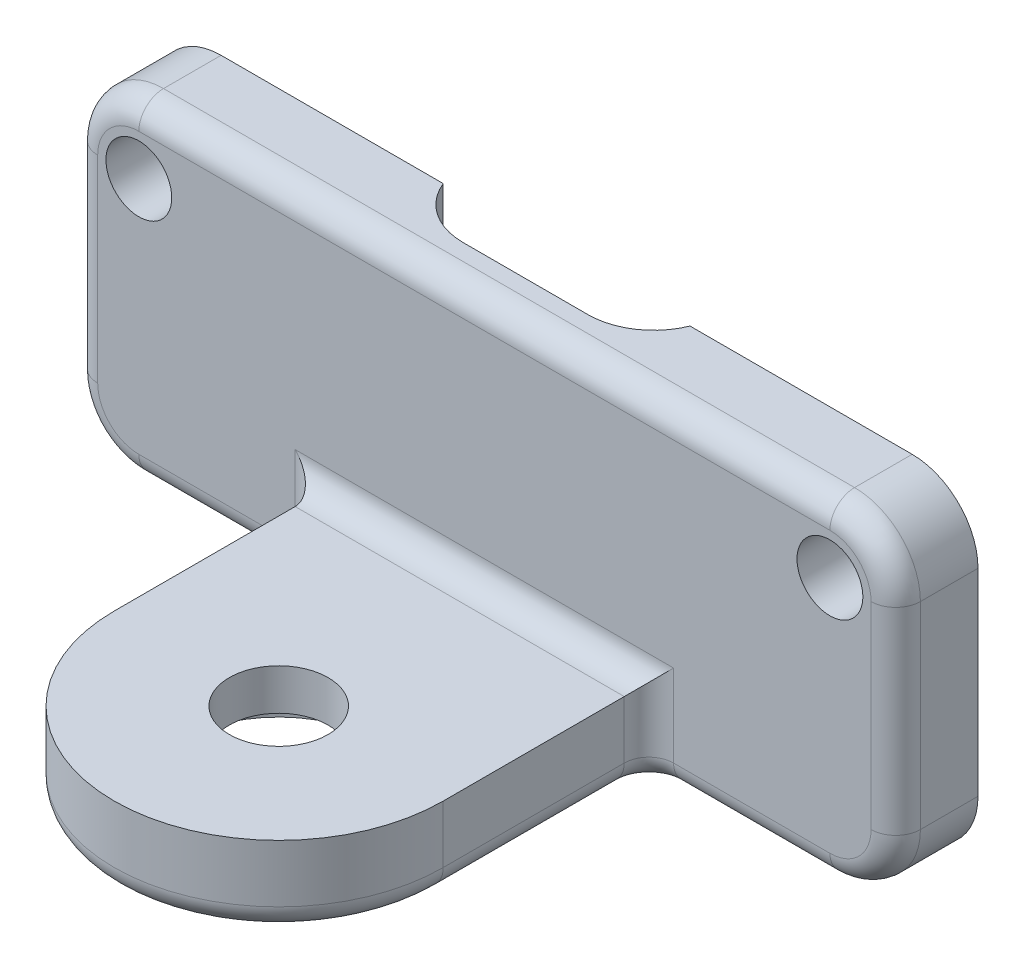
ISO-10303-21;
HEADER;
FILE_DESCRIPTION(('STEP AP214'),'2;1');
FILE_NAME('part.step','',(''),(''),'','','');
FILE_SCHEMA(('AUTOMOTIVE_DESIGN { 1 0 10303 214 1 1 1 1 }'));
ENDSEC;
DATA;
#1=APPLICATION_CONTEXT('core data for automotive mechanical design processes');
#2=APPLICATION_PROTOCOL_DEFINITION('international standard','automotive_design',2000,#1);
#3=PRODUCT_CONTEXT('',#1,'mechanical');
#4=PRODUCT('Part','Part','',(#3));
#5=PRODUCT_RELATED_PRODUCT_CATEGORY('part','',(#4));
#6=PRODUCT_DEFINITION_FORMATION('','',#4);
#7=PRODUCT_DEFINITION_CONTEXT('part definition',#1,'design');
#8=PRODUCT_DEFINITION('design','',#6,#7);
#9=PRODUCT_DEFINITION_SHAPE('','',#8);
#10=(LENGTH_UNIT() NAMED_UNIT(*) SI_UNIT(.MILLI.,.METRE.));
#11=(NAMED_UNIT(*) PLANE_ANGLE_UNIT() SI_UNIT($,.RADIAN.));
#12=(NAMED_UNIT(*) SI_UNIT($,.STERADIAN.) SOLID_ANGLE_UNIT());
#13=UNCERTAINTY_MEASURE_WITH_UNIT(LENGTH_MEASURE(1.E-05),#10,'distance_accuracy_value','');
#14=(GEOMETRIC_REPRESENTATION_CONTEXT(3) GLOBAL_UNCERTAINTY_ASSIGNED_CONTEXT((#13)) GLOBAL_UNIT_ASSIGNED_CONTEXT((#10,
#11,#12)) REPRESENTATION_CONTEXT('',''));
#15=CARTESIAN_POINT('',(0.,0.,0.));
#16=DIRECTION('',(0.,0.,1.));
#17=DIRECTION('',(1.,0.,0.));
#18=AXIS2_PLACEMENT_3D('',#15,#16,#17);
#19=CARTESIAN_POINT('',(0.,0.,0.));
#20=DIRECTION('',(0.,0.,1.));
#21=DIRECTION('',(1.,0.,0.));
#22=AXIS2_PLACEMENT_3D('',#19,#20,#21);
#23=PLANE('',#22);
#24=CARTESIAN_POINT('',(-42.,12.,0.));
#25=DIRECTION('',(0.,0.,1.));
#26=DIRECTION('',(1.,0.,0.));
#27=AXIS2_PLACEMENT_3D('',#24,#25,#26);
#28=CIRCLE('',#27,4.00000000000001);
#29=CARTESIAN_POINT('',(-38.,12.,0.));
#30=VERTEX_POINT('',#29);
#31=EDGE_CURVE('E305',#30,#30,#28,.T.);
#32=ORIENTED_EDGE('',*,*,#31,.T.);
#33=EDGE_LOOP('',(#32));
#34=FACE_BOUND('',#33,.T.);
#35=DIRECTION('',(1.,0.,0.));
#36=VECTOR('',#35,1.);
#37=CARTESIAN_POINT('',(50.,-20.,0.));
#38=LINE('',#37,#36);
#39=CARTESIAN_POINT('',(-42.,-20.,0.));
#40=VERTEX_POINT('',#39);
#41=CARTESIAN_POINT('',(-15.,-20.,0.));
#42=VERTEX_POINT('',#41);
#43=EDGE_CURVE('E395',#40,#42,#38,.T.);
#44=ORIENTED_EDGE('',*,*,#43,.F.);
#45=CARTESIAN_POINT('',(-42.,-12.,0.));
#46=DIRECTION('',(0.,0.,1.));
#47=DIRECTION('',(1.,0.,0.));
#48=AXIS2_PLACEMENT_3D('',#45,#46,#47);
#49=CIRCLE('',#48,8.);
#50=CARTESIAN_POINT('',(-50.,-12.,0.));
#51=VERTEX_POINT('',#50);
#52=EDGE_CURVE('E419',#40,#51,#49,.F.);
#53=ORIENTED_EDGE('',*,*,#52,.T.);
#54=DIRECTION('',(0.,-1.,0.));
#55=VECTOR('',#54,1.);
#56=CARTESIAN_POINT('',(-50.,-20.,0.));
#57=LINE('',#56,#55);
#58=CARTESIAN_POINT('',(-50.,12.,0.));
#59=VERTEX_POINT('',#58);
#60=EDGE_CURVE('E392',#59,#51,#57,.T.);
#61=ORIENTED_EDGE('',*,*,#60,.F.);
#62=CARTESIAN_POINT('',(-42.,12.,0.));
#63=DIRECTION('',(0.,0.,1.));
#64=DIRECTION('',(1.,0.,0.));
#65=AXIS2_PLACEMENT_3D('',#62,#63,#64);
#66=CIRCLE('',#65,8.);
#67=CARTESIAN_POINT('',(-42.,20.,0.));
#68=VERTEX_POINT('',#67);
#69=EDGE_CURVE('E417',#59,#68,#66,.F.);
#70=ORIENTED_EDGE('',*,*,#69,.T.);
#71=DIRECTION('',(-1.,0.,0.));
#72=VECTOR('',#71,1.);
#73=CARTESIAN_POINT('',(50.,20.,0.));
#74=LINE('',#73,#72);
#75=CARTESIAN_POINT('',(-15.,20.,0.));
#76=VERTEX_POINT('',#75);
#77=EDGE_CURVE('E215',#76,#68,#74,.T.);
#78=ORIENTED_EDGE('',*,*,#77,.F.);
#79=DIRECTION('',(0.,-1.,0.));
#80=VECTOR('',#79,1.);
#81=CARTESIAN_POINT('',(-15.,20.,0.));
#82=LINE('',#81,#80);
#83=EDGE_CURVE('E226',#76,#42,#82,.T.);
#84=ORIENTED_EDGE('',*,*,#83,.T.);
#85=EDGE_LOOP('',(#44,#53,#61,#70,#78,#84));
#86=FACE_BOUND('',#85,.T.);
#87=ADVANCED_FACE('F35',(#34,#86),#23,.F.);
#88=CARTESIAN_POINT('',(0.,0.,10.));
#89=DIRECTION('',(0.,0.,1.));
#90=DIRECTION('',(1.,0.,0.));
#91=AXIS2_PLACEMENT_3D('',#88,#89,#90);
#92=PLANE('',#91);
#93=CARTESIAN_POINT('',(-42.,12.,10.));
#94=DIRECTION('',(0.,0.,1.));
#95=DIRECTION('',(1.,0.,0.));
#96=AXIS2_PLACEMENT_3D('',#93,#94,#95);
#97=CIRCLE('',#96,4.00000000000001);
#98=CARTESIAN_POINT('',(-38.,12.,10.));
#99=VERTEX_POINT('',#98);
#100=EDGE_CURVE('E554',#99,#99,#97,.T.);
#101=ORIENTED_EDGE('',*,*,#100,.F.);
#102=EDGE_LOOP('',(#101));
#103=FACE_BOUND('',#102,.T.);
#104=CARTESIAN_POINT('',(42.,12.,10.));
#105=DIRECTION('',(0.,0.,1.));
#106=DIRECTION('',(-1.,0.,0.));
#107=AXIS2_PLACEMENT_3D('',#104,#105,#106);
#108=CIRCLE('',#107,4.00000000000001);
#109=CARTESIAN_POINT('',(38.,12.,10.));
#110=VERTEX_POINT('',#109);
#111=EDGE_CURVE('E555',#110,#110,#108,.T.);
#112=ORIENTED_EDGE('',*,*,#111,.F.);
#113=EDGE_LOOP('',(#112));
#114=FACE_BOUND('',#113,.T.);
#115=DIRECTION('',(-1.,0.,0.));
#116=VECTOR('',#115,1.);
#117=CARTESIAN_POINT('',(20.,-7.,10.));
#118=LINE('',#117,#116);
#119=CARTESIAN_POINT('',(-23.,-7.,10.));
#120=VERTEX_POINT('',#119);
#121=CARTESIAN_POINT('',(23.,-7.,10.));
#122=VERTEX_POINT('',#121);
#123=EDGE_CURVE('E285',#120,#122,#118,.F.);
#124=ORIENTED_EDGE('',*,*,#123,.T.);
#125=DIRECTION('',(0.,1.,0.));
#126=VECTOR('',#125,1.);
#127=CARTESIAN_POINT('',(23.,-20.,10.));
#128=LINE('',#127,#126);
#129=CARTESIAN_POINT('',(23.,-17.,10.));
#130=VERTEX_POINT('',#129);
#131=EDGE_CURVE('E287',#122,#130,#128,.F.);
#132=ORIENTED_EDGE('',*,*,#131,.T.);
#133=DIRECTION('',(1.,0.,0.));
#134=VECTOR('',#133,1.);
#135=CARTESIAN_POINT('',(42.,-17.,10.));
#136=LINE('',#135,#134);
#137=CARTESIAN_POINT('',(42.,-17.,10.));
#138=VERTEX_POINT('',#137);
#139=EDGE_CURVE('E265',#130,#138,#136,.T.);
#140=ORIENTED_EDGE('',*,*,#139,.T.);
#141=CARTESIAN_POINT('',(42.,-12.,10.));
#142=DIRECTION('',(0.,0.,1.));
#143=DIRECTION('',(1.,0.,0.));
#144=AXIS2_PLACEMENT_3D('',#141,#142,#143);
#145=CIRCLE('',#144,5.);
#146=CARTESIAN_POINT('',(47.,-12.,10.));
#147=VERTEX_POINT('',#146);
#148=EDGE_CURVE('E267',#138,#147,#145,.T.);
#149=ORIENTED_EDGE('',*,*,#148,.T.);
#150=DIRECTION('',(0.,1.,0.));
#151=VECTOR('',#150,1.);
#152=CARTESIAN_POINT('',(47.,12.,10.));
#153=LINE('',#152,#151);
#154=CARTESIAN_POINT('',(47.,12.,10.));
#155=VERTEX_POINT('',#154);
#156=EDGE_CURVE('E269',#147,#155,#153,.T.);
#157=ORIENTED_EDGE('',*,*,#156,.T.);
#158=CARTESIAN_POINT('',(42.,12.,10.));
#159=DIRECTION('',(0.,0.,1.));
#160=DIRECTION('',(1.,0.,0.));
#161=AXIS2_PLACEMENT_3D('',#158,#159,#160);
#162=CIRCLE('',#161,5.);
#163=CARTESIAN_POINT('',(42.,17.,10.));
#164=VERTEX_POINT('',#163);
#165=EDGE_CURVE('E271',#155,#164,#162,.T.);
#166=ORIENTED_EDGE('',*,*,#165,.T.);
#167=DIRECTION('',(-1.,0.,0.));
#168=VECTOR('',#167,1.);
#169=CARTESIAN_POINT('',(-42.,17.,10.));
#170=LINE('',#169,#168);
#171=CARTESIAN_POINT('',(-42.,17.,10.));
#172=VERTEX_POINT('',#171);
#173=EDGE_CURVE('E273',#164,#172,#170,.T.);
#174=ORIENTED_EDGE('',*,*,#173,.T.);
#175=CARTESIAN_POINT('',(-42.,12.,10.));
#176=DIRECTION('',(0.,0.,1.));
#177=DIRECTION('',(1.,0.,0.));
#178=AXIS2_PLACEMENT_3D('',#175,#176,#177);
#179=CIRCLE('',#178,5.);
#180=CARTESIAN_POINT('',(-47.,12.,10.));
#181=VERTEX_POINT('',#180);
#182=EDGE_CURVE('E275',#172,#181,#179,.T.);
#183=ORIENTED_EDGE('',*,*,#182,.T.);
#184=DIRECTION('',(0.,-1.,0.));
#185=VECTOR('',#184,1.);
#186=CARTESIAN_POINT('',(-47.,-12.,10.));
#187=LINE('',#186,#185);
#188=CARTESIAN_POINT('',(-47.,-12.,10.));
#189=VERTEX_POINT('',#188);
#190=EDGE_CURVE('E277',#181,#189,#187,.T.);
#191=ORIENTED_EDGE('',*,*,#190,.T.);
#192=CARTESIAN_POINT('',(-42.,-12.,10.));
#193=DIRECTION('',(0.,0.,1.));
#194=DIRECTION('',(1.,0.,0.));
#195=AXIS2_PLACEMENT_3D('',#192,#193,#194);
#196=CIRCLE('',#195,5.);
#197=CARTESIAN_POINT('',(-42.,-17.,10.));
#198=VERTEX_POINT('',#197);
#199=EDGE_CURVE('E279',#189,#198,#196,.T.);
#200=ORIENTED_EDGE('',*,*,#199,.T.);
#201=DIRECTION('',(1.,0.,0.));
#202=VECTOR('',#201,1.);
#203=CARTESIAN_POINT('',(-20.,-17.,10.));
#204=LINE('',#203,#202);
#205=CARTESIAN_POINT('',(-23.,-17.,10.));
#206=VERTEX_POINT('',#205);
#207=EDGE_CURVE('E281',#198,#206,#204,.T.);
#208=ORIENTED_EDGE('',*,*,#207,.T.);
#209=DIRECTION('',(0.,1.,0.));
#210=VECTOR('',#209,1.);
#211=CARTESIAN_POINT('',(-23.,0.,10.));
#212=LINE('',#211,#210);
#213=EDGE_CURVE('E283',#206,#120,#212,.T.);
#214=ORIENTED_EDGE('',*,*,#213,.T.);
#215=EDGE_LOOP('',(#124,#132,#140,#149,#157,#166,#174,#183,#191,#200,#208,#214));
#216=FACE_BOUND('',#215,.T.);
#217=ADVANCED_FACE('F465',(#103,#114,#216),#92,.T.);
#218=CARTESIAN_POINT('',(-50.,-20.,10.));
#219=DIRECTION('',(1.,0.,0.));
#220=DIRECTION('',(0.,1.,0.));
#221=AXIS2_PLACEMENT_3D('',#218,#219,#220);
#222=PLANE('',#221);
#223=DIRECTION('',(0.,0.,-1.));
#224=VECTOR('',#223,1.);
#225=CARTESIAN_POINT('',(-50.,-12.,10.));
#226=LINE('',#225,#224);
#227=CARTESIAN_POINT('',(-50.,-12.,7.));
#228=VERTEX_POINT('',#227);
#229=EDGE_CURVE('E423',#51,#228,#226,.F.);
#230=ORIENTED_EDGE('',*,*,#229,.T.);
#231=DIRECTION('',(0.,-1.,0.));
#232=VECTOR('',#231,1.);
#233=CARTESIAN_POINT('',(-50.,12.,7.));
#234=LINE('',#233,#232);
#235=CARTESIAN_POINT('',(-50.,12.,7.));
#236=VERTEX_POINT('',#235);
#237=EDGE_CURVE('E294',#228,#236,#234,.F.);
#238=ORIENTED_EDGE('',*,*,#237,.T.);
#239=DIRECTION('',(0.,0.,-1.));
#240=VECTOR('',#239,1.);
#241=CARTESIAN_POINT('',(-50.,12.,10.));
#242=LINE('',#241,#240);
#243=EDGE_CURVE('E421',#236,#59,#242,.T.);
#244=ORIENTED_EDGE('',*,*,#243,.T.);
#245=ORIENTED_EDGE('',*,*,#60,.T.);
#246=EDGE_LOOP('',(#230,#238,#244,#245));
#247=FACE_BOUND('',#246,.T.);
#248=ADVANCED_FACE('F448',(#247),#222,.F.);
#249=CARTESIAN_POINT('',(50.,-20.,10.));
#250=DIRECTION('',(0.,1.,0.));
#251=DIRECTION('',(-1.,0.,0.));
#252=AXIS2_PLACEMENT_3D('',#249,#250,#251);
#253=PLANE('',#252);
#254=CARTESIAN_POINT('',(0.,-20.,35.));
#255=DIRECTION('',(0.,-1.,0.));
#256=DIRECTION('',(1.,0.,0.));
#257=AXIS2_PLACEMENT_3D('',#254,#255,#256);
#258=CIRCLE('',#257,12.5);
#259=CARTESIAN_POINT('',(12.5,-20.,35.));
#260=VERTEX_POINT('',#259);
#261=EDGE_CURVE('E371',#260,#260,#258,.T.);
#262=ORIENTED_EDGE('',*,*,#261,.F.);
#263=EDGE_LOOP('',(#262));
#264=FACE_BOUND('',#263,.T.);
#265=CARTESIAN_POINT('',(-23.,-20.,13.));
#266=DIRECTION('',(0.,1.,0.));
#267=DIRECTION('',(-1.,0.,0.));
#268=AXIS2_PLACEMENT_3D('',#265,#266,#267);
#269=CIRCLE('',#268,6.);
#270=CARTESIAN_POINT('',(-23.,-20.,7.));
#271=VERTEX_POINT('',#270);
#272=CARTESIAN_POINT('',(-17.,-20.,13.));
#273=VERTEX_POINT('',#272);
#274=EDGE_CURVE('E252',#271,#273,#269,.F.);
#275=ORIENTED_EDGE('',*,*,#274,.F.);
#276=DIRECTION('',(1.,0.,0.));
#277=VECTOR('',#276,1.);
#278=CARTESIAN_POINT('',(-42.,-20.,7.));
#279=LINE('',#278,#277);
#280=CARTESIAN_POINT('',(-42.,-20.,7.));
#281=VERTEX_POINT('',#280);
#282=EDGE_CURVE('E255',#271,#281,#279,.F.);
#283=ORIENTED_EDGE('',*,*,#282,.T.);
#284=DIRECTION('',(0.,0.,-1.));
#285=VECTOR('',#284,1.);
#286=CARTESIAN_POINT('',(-42.,-20.,10.));
#287=LINE('',#286,#285);
#288=EDGE_CURVE('E412',#281,#40,#287,.T.);
#289=ORIENTED_EDGE('',*,*,#288,.T.);
#290=ORIENTED_EDGE('',*,*,#43,.T.);
#291=CARTESIAN_POINT('',(-7.58380151290435,-20.,-3.));
#292=DIRECTION('',(0.,1.,0.));
#293=DIRECTION('',(-1.,0.,0.));
#294=AXIS2_PLACEMENT_3D('',#291,#292,#293);
#295=CIRCLE('',#294,8.);
#296=CARTESIAN_POINT('',(-7.58380151290435,-20.,5.));
#297=VERTEX_POINT('',#296);
#298=EDGE_CURVE('E429',#42,#297,#295,.T.);
#299=ORIENTED_EDGE('',*,*,#298,.T.);
#300=DIRECTION('',(1.,0.,0.));
#301=VECTOR('',#300,1.);
#302=CARTESIAN_POINT('',(-15.,-20.,5.));
#303=LINE('',#302,#301);
#304=CARTESIAN_POINT('',(7.58380151290433,-20.,5.));
#305=VERTEX_POINT('',#304);
#306=EDGE_CURVE('E353',#297,#305,#303,.T.);
#307=ORIENTED_EDGE('',*,*,#306,.T.);
#308=CARTESIAN_POINT('',(7.58380151290433,-20.,-3.));
#309=DIRECTION('',(0.,1.,0.));
#310=DIRECTION('',(-1.,0.,0.));
#311=AXIS2_PLACEMENT_3D('',#308,#309,#310);
#312=CIRCLE('',#311,8.);
#313=CARTESIAN_POINT('',(15.,-20.,0.));
#314=VERTEX_POINT('',#313);
#315=EDGE_CURVE('E232',#305,#314,#312,.T.);
#316=ORIENTED_EDGE('',*,*,#315,.T.);
#317=CARTESIAN_POINT('',(42.,-20.,0.));
#318=VERTEX_POINT('',#317);
#319=EDGE_CURVE('E223',#314,#318,#38,.T.);
#320=ORIENTED_EDGE('',*,*,#319,.T.);
#321=DIRECTION('',(0.,0.,-1.));
#322=VECTOR('',#321,1.);
#323=CARTESIAN_POINT('',(42.,-20.,10.));
#324=LINE('',#323,#322);
#325=CARTESIAN_POINT('',(42.,-20.,7.));
#326=VERTEX_POINT('',#325);
#327=EDGE_CURVE('E414',#318,#326,#324,.F.);
#328=ORIENTED_EDGE('',*,*,#327,.T.);
#329=DIRECTION('',(1.,0.,0.));
#330=VECTOR('',#329,1.);
#331=CARTESIAN_POINT('',(20.,-20.,7.));
#332=LINE('',#331,#330);
#333=CARTESIAN_POINT('',(23.,-20.,7.));
#334=VERTEX_POINT('',#333);
#335=EDGE_CURVE('E243',#326,#334,#332,.F.);
#336=ORIENTED_EDGE('',*,*,#335,.T.);
#337=CARTESIAN_POINT('',(23.,-20.,13.));
#338=DIRECTION('',(0.,1.,0.));
#339=DIRECTION('',(-1.,0.,0.));
#340=AXIS2_PLACEMENT_3D('',#337,#338,#339);
#341=CIRCLE('',#340,6.);
#342=CARTESIAN_POINT('',(17.,-20.,13.));
#343=VERTEX_POINT('',#342);
#344=EDGE_CURVE('E235',#343,#334,#341,.F.);
#345=ORIENTED_EDGE('',*,*,#344,.F.);
#346=DIRECTION('',(0.,0.,1.));
#347=VECTOR('',#346,1.);
#348=CARTESIAN_POINT('',(17.,-20.,35.));
#349=LINE('',#348,#347);
#350=CARTESIAN_POINT('',(17.,-20.,35.));
#351=VERTEX_POINT('',#350);
#352=EDGE_CURVE('E245',#343,#351,#349,.T.);
#353=ORIENTED_EDGE('',*,*,#352,.T.);
#354=CARTESIAN_POINT('',(0.,-20.,35.));
#355=DIRECTION('',(0.,1.,0.));
#356=DIRECTION('',(-1.,0.,0.));
#357=AXIS2_PLACEMENT_3D('',#354,#355,#356);
#358=CIRCLE('',#357,17.);
#359=CARTESIAN_POINT('',(-17.,-20.,35.));
#360=VERTEX_POINT('',#359);
#361=EDGE_CURVE('E247',#351,#360,#358,.F.);
#362=ORIENTED_EDGE('',*,*,#361,.T.);
#363=DIRECTION('',(0.,0.,1.));
#364=VECTOR('',#363,1.);
#365=CARTESIAN_POINT('',(-17.,-20.,10.));
#366=LINE('',#365,#364);
#367=EDGE_CURVE('E250',#360,#273,#366,.F.);
#368=ORIENTED_EDGE('',*,*,#367,.T.);
#369=EDGE_LOOP('',(#275,#283,#289,#290,#299,#307,#316,#320,#328,#336,#345,#353,#362,#368));
#370=FACE_BOUND('',#369,.T.);
#371=ADVANCED_FACE('F442',(#264,#370),#253,.F.);
#372=CARTESIAN_POINT('',(50.,-20.,10.));
#373=DIRECTION('',(-1.,0.,0.));
#374=DIRECTION('',(0.,0.,1.));
#375=AXIS2_PLACEMENT_3D('',#372,#373,#374);
#376=PLANE('',#375);
#377=DIRECTION('',(0.,0.,-1.));
#378=VECTOR('',#377,1.);
#379=CARTESIAN_POINT('',(50.,12.,10.));
#380=LINE('',#379,#378);
#381=CARTESIAN_POINT('',(50.,12.,0.));
#382=VERTEX_POINT('',#381);
#383=CARTESIAN_POINT('',(50.,12.,7.));
#384=VERTEX_POINT('',#383);
#385=EDGE_CURVE('E404',#382,#384,#380,.F.);
#386=ORIENTED_EDGE('',*,*,#385,.T.);
#387=DIRECTION('',(0.,1.,0.));
#388=VECTOR('',#387,1.);
#389=CARTESIAN_POINT('',(50.,-12.,7.));
#390=LINE('',#389,#388);
#391=CARTESIAN_POINT('',(50.,-12.,7.));
#392=VERTEX_POINT('',#391);
#393=EDGE_CURVE('E44',#384,#392,#390,.F.);
#394=ORIENTED_EDGE('',*,*,#393,.T.);
#395=DIRECTION('',(0.,0.,-1.));
#396=VECTOR('',#395,1.);
#397=CARTESIAN_POINT('',(50.,-12.,10.));
#398=LINE('',#397,#396);
#399=CARTESIAN_POINT('',(50.,-12.,0.));
#400=VERTEX_POINT('',#399);
#401=EDGE_CURVE('E406',#392,#400,#398,.T.);
#402=ORIENTED_EDGE('',*,*,#401,.T.);
#403=DIRECTION('',(0.,1.,0.));
#404=VECTOR('',#403,1.);
#405=CARTESIAN_POINT('',(50.,-20.,0.));
#406=LINE('',#405,#404);
#407=EDGE_CURVE('E398',#400,#382,#406,.T.);
#408=ORIENTED_EDGE('',*,*,#407,.T.);
#409=EDGE_LOOP('',(#386,#394,#402,#408));
#410=FACE_BOUND('',#409,.T.);
#411=ADVANCED_FACE('F511',(#410),#376,.F.);
#412=CARTESIAN_POINT('',(50.,20.,10.));
#413=DIRECTION('',(0.,-1.,0.));
#414=DIRECTION('',(1.,0.,0.));
#415=AXIS2_PLACEMENT_3D('',#412,#413,#414);
#416=PLANE('',#415);
#417=DIRECTION('',(0.,0.,-1.));
#418=VECTOR('',#417,1.);
#419=CARTESIAN_POINT('',(-42.,20.,10.));
#420=LINE('',#419,#418);
#421=CARTESIAN_POINT('',(-42.,20.,7.));
#422=VERTEX_POINT('',#421);
#423=EDGE_CURVE('E427',#68,#422,#420,.F.);
#424=ORIENTED_EDGE('',*,*,#423,.T.);
#425=DIRECTION('',(-1.,0.,0.));
#426=VECTOR('',#425,1.);
#427=CARTESIAN_POINT('',(42.,20.,7.));
#428=LINE('',#427,#426);
#429=CARTESIAN_POINT('',(42.,20.,7.));
#430=VERTEX_POINT('',#429);
#431=EDGE_CURVE('E298',#422,#430,#428,.F.);
#432=ORIENTED_EDGE('',*,*,#431,.T.);
#433=DIRECTION('',(0.,0.,-1.));
#434=VECTOR('',#433,1.);
#435=CARTESIAN_POINT('',(42.,20.,10.));
#436=LINE('',#435,#434);
#437=CARTESIAN_POINT('',(42.,20.,0.));
#438=VERTEX_POINT('',#437);
#439=EDGE_CURVE('E211',#430,#438,#436,.T.);
#440=ORIENTED_EDGE('',*,*,#439,.T.);
#441=CARTESIAN_POINT('',(15.,20.,0.));
#442=VERTEX_POINT('',#441);
#443=EDGE_CURVE('E203',#438,#442,#74,.T.);
#444=ORIENTED_EDGE('',*,*,#443,.T.);
#445=CARTESIAN_POINT('',(7.58380151290432,20.,-3.));
#446=DIRECTION('',(0.,-1.,0.));
#447=DIRECTION('',(1.,0.,0.));
#448=AXIS2_PLACEMENT_3D('',#445,#446,#447);
#449=CIRCLE('',#448,8.);
#450=CARTESIAN_POINT('',(7.58380151290432,20.,5.));
#451=VERTEX_POINT('',#450);
#452=EDGE_CURVE('E209',#442,#451,#449,.T.);
#453=ORIENTED_EDGE('',*,*,#452,.T.);
#454=DIRECTION('',(1.,0.,0.));
#455=VECTOR('',#454,1.);
#456=CARTESIAN_POINT('',(-15.,20.,5.));
#457=LINE('',#456,#455);
#458=CARTESIAN_POINT('',(-7.58380151290435,20.,5.));
#459=VERTEX_POINT('',#458);
#460=EDGE_CURVE('E359',#459,#451,#457,.T.);
#461=ORIENTED_EDGE('',*,*,#460,.F.);
#462=CARTESIAN_POINT('',(-7.58380151290435,20.,-3.));
#463=DIRECTION('',(0.,-1.,0.));
#464=DIRECTION('',(1.,0.,0.));
#465=AXIS2_PLACEMENT_3D('',#462,#463,#464);
#466=CIRCLE('',#465,8.);
#467=EDGE_CURVE('E237',#459,#76,#466,.T.);
#468=ORIENTED_EDGE('',*,*,#467,.T.);
#469=ORIENTED_EDGE('',*,*,#77,.T.);
#470=EDGE_LOOP('',(#424,#432,#440,#444,#453,#461,#468,#469));
#471=FACE_BOUND('',#470,.T.);
#472=ADVANCED_FACE('F206',(#471),#416,.F.);
#473=CARTESIAN_POINT('',(42.,12.,0.));
#474=DIRECTION('',(0.,0.,1.));
#475=DIRECTION('',(-1.,0.,0.));
#476=AXIS2_PLACEMENT_3D('',#473,#474,#475);
#477=CIRCLE('',#476,4.00000000000001);
#478=CARTESIAN_POINT('',(38.,12.,0.));
#479=VERTEX_POINT('',#478);
#480=EDGE_CURVE('E552',#479,#479,#477,.T.);
#481=ORIENTED_EDGE('',*,*,#480,.T.);
#482=EDGE_LOOP('',(#481));
#483=FACE_BOUND('',#482,.T.);
#484=ORIENTED_EDGE('',*,*,#407,.F.);
#485=CARTESIAN_POINT('',(42.,-12.,0.));
#486=DIRECTION('',(0.,0.,1.));
#487=DIRECTION('',(1.,0.,0.));
#488=AXIS2_PLACEMENT_3D('',#485,#486,#487);
#489=CIRCLE('',#488,8.);
#490=EDGE_CURVE('E410',#400,#318,#489,.F.);
#491=ORIENTED_EDGE('',*,*,#490,.T.);
#492=ORIENTED_EDGE('',*,*,#319,.F.);
#493=DIRECTION('',(0.,-1.,0.));
#494=VECTOR('',#493,1.);
#495=CARTESIAN_POINT('',(15.,20.,0.));
#496=LINE('',#495,#494);
#497=EDGE_CURVE('E219',#442,#314,#496,.T.);
#498=ORIENTED_EDGE('',*,*,#497,.F.);
#499=ORIENTED_EDGE('',*,*,#443,.F.);
#500=CARTESIAN_POINT('',(42.,12.,0.));
#501=DIRECTION('',(0.,0.,1.));
#502=DIRECTION('',(1.,0.,0.));
#503=AXIS2_PLACEMENT_3D('',#500,#501,#502);
#504=CIRCLE('',#503,8.);
#505=EDGE_CURVE('E408',#438,#382,#504,.F.);
#506=ORIENTED_EDGE('',*,*,#505,.T.);
#507=EDGE_LOOP('',(#484,#491,#492,#498,#499,#506));
#508=FACE_BOUND('',#507,.T.);
#509=ADVANCED_FACE('F221',(#483,#508),#23,.F.);
#510=CARTESIAN_POINT('',(-20.,-10.,0.));
#511=DIRECTION('',(1.,0.,0.));
#512=DIRECTION('',(0.,1.,0.));
#513=AXIS2_PLACEMENT_3D('',#510,#511,#512);
#514=PLANE('',#513);
#515=DIRECTION('',(0.,1.,0.));
#516=VECTOR('',#515,1.);
#517=CARTESIAN_POINT('',(-20.,-10.,13.));
#518=LINE('',#517,#516);
#519=CARTESIAN_POINT('',(-20.,-10.,13.));
#520=VERTEX_POINT('',#519);
#521=CARTESIAN_POINT('',(-20.,-17.,13.));
#522=VERTEX_POINT('',#521);
#523=EDGE_CURVE('E261',#520,#522,#518,.F.);
#524=ORIENTED_EDGE('',*,*,#523,.T.);
#525=DIRECTION('',(0.,0.,1.));
#526=VECTOR('',#525,1.);
#527=CARTESIAN_POINT('',(-20.,-17.,0.));
#528=LINE('',#527,#526);
#529=CARTESIAN_POINT('',(-20.,-17.,35.));
#530=VERTEX_POINT('',#529);
#531=EDGE_CURVE('E263',#522,#530,#528,.T.);
#532=ORIENTED_EDGE('',*,*,#531,.T.);
#533=DIRECTION('',(0.,-1.,0.));
#534=VECTOR('',#533,1.);
#535=CARTESIAN_POINT('',(-20.,-10.,35.));
#536=LINE('',#535,#534);
#537=CARTESIAN_POINT('',(-20.,-10.,35.));
#538=VERTEX_POINT('',#537);
#539=EDGE_CURVE('E389',#538,#530,#536,.T.);
#540=ORIENTED_EDGE('',*,*,#539,.F.);
#541=DIRECTION('',(0.,0.,1.));
#542=VECTOR('',#541,1.);
#543=CARTESIAN_POINT('',(-20.,-10.,0.));
#544=LINE('',#543,#542);
#545=EDGE_CURVE('E377',#520,#538,#544,.T.);
#546=ORIENTED_EDGE('',*,*,#545,.F.);
#547=EDGE_LOOP('',(#524,#532,#540,#546));
#548=FACE_BOUND('',#547,.T.);
#549=ADVANCED_FACE('F541',(#548),#514,.F.);
#550=CARTESIAN_POINT('',(0.,-10.,35.));
#551=DIRECTION('',(0.,-1.,0.));
#552=DIRECTION('',(1.,0.,0.));
#553=AXIS2_PLACEMENT_3D('',#550,#551,#552);
#554=CYLINDRICAL_SURFACE('',#553,20.);
#555=ORIENTED_EDGE('',*,*,#539,.T.);
#556=CARTESIAN_POINT('',(0.,-17.,35.));
#557=DIRECTION('',(0.,1.,0.));
#558=DIRECTION('',(-1.,0.,0.));
#559=AXIS2_PLACEMENT_3D('',#556,#557,#558);
#560=CIRCLE('',#559,20.);
#561=CARTESIAN_POINT('',(20.,-17.,35.));
#562=VERTEX_POINT('',#561);
#563=EDGE_CURVE('E231',#530,#562,#560,.T.);
#564=ORIENTED_EDGE('',*,*,#563,.T.);
#565=DIRECTION('',(0.,-1.,0.));
#566=VECTOR('',#565,1.);
#567=CARTESIAN_POINT('',(20.,-10.,35.));
#568=LINE('',#567,#566);
#569=CARTESIAN_POINT('',(20.,-10.,35.));
#570=VERTEX_POINT('',#569);
#571=EDGE_CURVE('E386',#570,#562,#568,.T.);
#572=ORIENTED_EDGE('',*,*,#571,.F.);
#573=CARTESIAN_POINT('',(0.,-10.,35.));
#574=DIRECTION('',(0.,1.,0.));
#575=DIRECTION('',(-1.,0.,0.));
#576=AXIS2_PLACEMENT_3D('',#573,#574,#575);
#577=CIRCLE('',#576,20.);
#578=EDGE_CURVE('E381',#538,#570,#577,.T.);
#579=ORIENTED_EDGE('',*,*,#578,.F.);
#580=EDGE_LOOP('',(#555,#564,#572,#579));
#581=FACE_BOUND('',#580,.T.);
#582=ADVANCED_FACE('F547',(#581),#554,.T.);
#583=CARTESIAN_POINT('',(20.,-10.,0.));
#584=DIRECTION('',(1.,0.,0.));
#585=DIRECTION('',(0.,1.,0.));
#586=AXIS2_PLACEMENT_3D('',#583,#584,#585);
#587=PLANE('',#586);
#588=ORIENTED_EDGE('',*,*,#571,.T.);
#589=DIRECTION('',(0.,0.,1.));
#590=VECTOR('',#589,1.);
#591=CARTESIAN_POINT('',(20.,-17.,10.));
#592=LINE('',#591,#590);
#593=CARTESIAN_POINT('',(20.,-17.,13.));
#594=VERTEX_POINT('',#593);
#595=EDGE_CURVE('E259',#562,#594,#592,.F.);
#596=ORIENTED_EDGE('',*,*,#595,.T.);
#597=DIRECTION('',(0.,1.,0.));
#598=VECTOR('',#597,1.);
#599=CARTESIAN_POINT('',(20.,-10.,13.));
#600=LINE('',#599,#598);
#601=CARTESIAN_POINT('',(20.,-10.,13.));
#602=VERTEX_POINT('',#601);
#603=EDGE_CURVE('E257',#594,#602,#600,.T.);
#604=ORIENTED_EDGE('',*,*,#603,.T.);
#605=DIRECTION('',(0.,0.,1.));
#606=VECTOR('',#605,1.);
#607=CARTESIAN_POINT('',(20.,-10.,0.));
#608=LINE('',#607,#606);
#609=EDGE_CURVE('E384',#602,#570,#608,.T.);
#610=ORIENTED_EDGE('',*,*,#609,.T.);
#611=EDGE_LOOP('',(#588,#596,#604,#610));
#612=FACE_BOUND('',#611,.T.);
#613=ADVANCED_FACE('F668',(#612),#587,.T.);
#614=CARTESIAN_POINT('',(0.,-10.,35.));
#615=DIRECTION('',(0.,1.,0.));
#616=DIRECTION('',(-1.,0.,0.));
#617=AXIS2_PLACEMENT_3D('',#614,#615,#616);
#618=PLANE('',#617);
#619=CARTESIAN_POINT('',(0.,-10.,35.));
#620=DIRECTION('',(0.,-1.,0.));
#621=DIRECTION('',(1.,0.,0.));
#622=AXIS2_PLACEMENT_3D('',#619,#620,#621);
#623=CIRCLE('',#622,6.);
#624=CARTESIAN_POINT('',(5.99999999999999,-10.,35.));
#625=VERTEX_POINT('',#624);
#626=EDGE_CURVE('E368',#625,#625,#623,.T.);
#627=ORIENTED_EDGE('',*,*,#626,.T.);
#628=EDGE_LOOP('',(#627));
#629=FACE_BOUND('',#628,.T.);
#630=ORIENTED_EDGE('',*,*,#609,.F.);
#631=DIRECTION('',(-1.,0.,0.));
#632=VECTOR('',#631,1.);
#633=CARTESIAN_POINT('',(-20.,-10.,13.));
#634=LINE('',#633,#632);
#635=EDGE_CURVE('E290',#602,#520,#634,.T.);
#636=ORIENTED_EDGE('',*,*,#635,.T.);
#637=ORIENTED_EDGE('',*,*,#545,.T.);
#638=ORIENTED_EDGE('',*,*,#578,.T.);
#639=EDGE_LOOP('',(#630,#636,#637,#638));
#640=FACE_BOUND('',#639,.T.);
#641=ADVANCED_FACE('F678',(#629,#640),#618,.T.);
#642=CARTESIAN_POINT('',(0.,-15.,35.));
#643=DIRECTION('',(0.,-1.,0.));
#644=DIRECTION('',(1.,0.,0.));
#645=AXIS2_PLACEMENT_3D('',#642,#643,#644);
#646=CYLINDRICAL_SURFACE('',#645,12.5);
#647=CARTESIAN_POINT('',(0.,-15.,35.));
#648=DIRECTION('',(0.,-1.,0.));
#649=DIRECTION('',(1.,0.,0.));
#650=AXIS2_PLACEMENT_3D('',#647,#648,#649);
#651=CIRCLE('',#650,12.5);
#652=CARTESIAN_POINT('',(12.5,-15.,35.));
#653=VERTEX_POINT('',#652);
#654=EDGE_CURVE('E374',#653,#653,#651,.T.);
#655=ORIENTED_EDGE('',*,*,#654,.F.);
#656=EDGE_LOOP('',(#655));
#657=FACE_BOUND('',#656,.T.);
#658=ORIENTED_EDGE('',*,*,#261,.T.);
#659=EDGE_LOOP('',(#658));
#660=FACE_BOUND('',#659,.T.);
#661=ADVANCED_FACE('F688',(#657,#660),#646,.F.);
#662=CARTESIAN_POINT('',(0.,-15.,35.));
#663=DIRECTION('',(0.,-1.,0.));
#664=DIRECTION('',(1.,0.,0.));
#665=AXIS2_PLACEMENT_3D('',#662,#663,#664);
#666=PLANE('',#665);
#667=CARTESIAN_POINT('',(0.,-15.,35.));
#668=DIRECTION('',(0.,-1.,0.));
#669=DIRECTION('',(1.,0.,0.));
#670=AXIS2_PLACEMENT_3D('',#667,#668,#669);
#671=CIRCLE('',#670,6.);
#672=CARTESIAN_POINT('',(5.99999999999999,-15.,35.));
#673=VERTEX_POINT('',#672);
#674=EDGE_CURVE('E225',#673,#673,#671,.T.);
#675=ORIENTED_EDGE('',*,*,#674,.F.);
#676=EDGE_LOOP('',(#675));
#677=FACE_BOUND('',#676,.T.);
#678=ORIENTED_EDGE('',*,*,#654,.T.);
#679=EDGE_LOOP('',(#678));
#680=FACE_BOUND('',#679,.T.);
#681=ADVANCED_FACE('F526',(#677,#680),#666,.T.);
#682=CARTESIAN_POINT('',(0.,-10.,35.));
#683=DIRECTION('',(0.,-1.,0.));
#684=DIRECTION('',(1.,0.,0.));
#685=AXIS2_PLACEMENT_3D('',#682,#683,#684);
#686=CYLINDRICAL_SURFACE('',#685,6.);
#687=ORIENTED_EDGE('',*,*,#626,.F.);
#688=EDGE_LOOP('',(#687));
#689=FACE_BOUND('',#688,.T.);
#690=ORIENTED_EDGE('',*,*,#674,.T.);
#691=EDGE_LOOP('',(#690));
#692=FACE_BOUND('',#691,.T.);
#693=ADVANCED_FACE('F519',(#689,#692),#686,.F.);
#694=CARTESIAN_POINT('',(-15.,20.,5.));
#695=DIRECTION('',(0.,0.,-1.));
#696=DIRECTION('',(-1.,0.,0.));
#697=AXIS2_PLACEMENT_3D('',#694,#695,#696);
#698=PLANE('',#697);
#699=ORIENTED_EDGE('',*,*,#306,.F.);
#700=DIRECTION('',(0.,1.,0.));
#701=VECTOR('',#700,1.);
#702=CARTESIAN_POINT('',(-7.58380151290435,20.,5.));
#703=LINE('',#702,#701);
#704=EDGE_CURVE('E402',#297,#459,#703,.T.);
#705=ORIENTED_EDGE('',*,*,#704,.T.);
#706=ORIENTED_EDGE('',*,*,#460,.T.);
#707=DIRECTION('',(0.,1.,0.));
#708=VECTOR('',#707,1.);
#709=CARTESIAN_POINT('',(7.58380151290433,-20.,5.));
#710=LINE('',#709,#708);
#711=EDGE_CURVE('E214',#451,#305,#710,.F.);
#712=ORIENTED_EDGE('',*,*,#711,.T.);
#713=EDGE_LOOP('',(#699,#705,#706,#712));
#714=FACE_BOUND('',#713,.T.);
#715=ADVANCED_FACE('F517',(#714),#698,.T.);
#716=CARTESIAN_POINT('',(-7.58380151290435,20.,-3.));
#717=DIRECTION('',(0.,-1.,0.));
#718=DIRECTION('',(1.,0.,0.));
#719=AXIS2_PLACEMENT_3D('',#716,#717,#718);
#720=CYLINDRICAL_SURFACE('',#719,8.);
#721=ORIENTED_EDGE('',*,*,#467,.F.);
#722=ORIENTED_EDGE('',*,*,#704,.F.);
#723=ORIENTED_EDGE('',*,*,#298,.F.);
#724=ORIENTED_EDGE('',*,*,#83,.F.);
#725=EDGE_LOOP('',(#721,#722,#723,#724));
#726=FACE_BOUND('',#725,.T.);
#727=ADVANCED_FACE('F441',(#726),#720,.F.);
#728=CARTESIAN_POINT('',(7.58380151290432,20.,-3.));
#729=DIRECTION('',(0.,-1.,0.));
#730=DIRECTION('',(1.,0.,0.));
#731=AXIS2_PLACEMENT_3D('',#728,#729,#730);
#732=CYLINDRICAL_SURFACE('',#731,8.);
#733=ORIENTED_EDGE('',*,*,#452,.F.);
#734=ORIENTED_EDGE('',*,*,#497,.T.);
#735=ORIENTED_EDGE('',*,*,#315,.F.);
#736=ORIENTED_EDGE('',*,*,#711,.F.);
#737=EDGE_LOOP('',(#733,#734,#735,#736));
#738=FACE_BOUND('',#737,.T.);
#739=ADVANCED_FACE('F229',(#738),#732,.F.);
#740=CARTESIAN_POINT('',(42.,-12.,10.));
#741=DIRECTION('',(0.,0.,-1.));
#742=DIRECTION('',(-1.,0.,0.));
#743=AXIS2_PLACEMENT_3D('',#740,#741,#742);
#744=CYLINDRICAL_SURFACE('',#743,8.);
#745=ORIENTED_EDGE('',*,*,#401,.F.);
#746=CARTESIAN_POINT('',(42.,-12.,7.));
#747=DIRECTION('',(0.,0.,1.));
#748=DIRECTION('',(1.,0.,0.));
#749=AXIS2_PLACEMENT_3D('',#746,#747,#748);
#750=CIRCLE('',#749,8.);
#751=EDGE_CURVE('E11',#392,#326,#750,.F.);
#752=ORIENTED_EDGE('',*,*,#751,.T.);
#753=ORIENTED_EDGE('',*,*,#327,.F.);
#754=ORIENTED_EDGE('',*,*,#490,.F.);
#755=EDGE_LOOP('',(#745,#752,#753,#754));
#756=FACE_BOUND('',#755,.T.);
#757=ADVANCED_FACE('F515',(#756),#744,.T.);
#758=CARTESIAN_POINT('',(-42.,-12.,10.));
#759=DIRECTION('',(0.,0.,-1.));
#760=DIRECTION('',(-1.,0.,0.));
#761=AXIS2_PLACEMENT_3D('',#758,#759,#760);
#762=CYLINDRICAL_SURFACE('',#761,8.);
#763=ORIENTED_EDGE('',*,*,#288,.F.);
#764=CARTESIAN_POINT('',(-42.,-12.,7.));
#765=DIRECTION('',(0.,0.,1.));
#766=DIRECTION('',(1.,0.,0.));
#767=AXIS2_PLACEMENT_3D('',#764,#765,#766);
#768=CIRCLE('',#767,8.);
#769=EDGE_CURVE('E292',#281,#228,#768,.F.);
#770=ORIENTED_EDGE('',*,*,#769,.T.);
#771=ORIENTED_EDGE('',*,*,#229,.F.);
#772=ORIENTED_EDGE('',*,*,#52,.F.);
#773=EDGE_LOOP('',(#763,#770,#771,#772));
#774=FACE_BOUND('',#773,.T.);
#775=ADVANCED_FACE('F451',(#774),#762,.T.);
#776=CARTESIAN_POINT('',(-42.,12.,10.));
#777=DIRECTION('',(0.,0.,-1.));
#778=DIRECTION('',(-1.,0.,0.));
#779=AXIS2_PLACEMENT_3D('',#776,#777,#778);
#780=CYLINDRICAL_SURFACE('',#779,8.);
#781=ORIENTED_EDGE('',*,*,#243,.F.);
#782=CARTESIAN_POINT('',(-42.,12.,7.));
#783=DIRECTION('',(0.,0.,1.));
#784=DIRECTION('',(1.,0.,0.));
#785=AXIS2_PLACEMENT_3D('',#782,#783,#784);
#786=CIRCLE('',#785,8.);
#787=EDGE_CURVE('E296',#236,#422,#786,.F.);
#788=ORIENTED_EDGE('',*,*,#787,.T.);
#789=ORIENTED_EDGE('',*,*,#423,.F.);
#790=ORIENTED_EDGE('',*,*,#69,.F.);
#791=EDGE_LOOP('',(#781,#788,#789,#790));
#792=FACE_BOUND('',#791,.T.);
#793=ADVANCED_FACE('F509',(#792),#780,.T.);
#794=CARTESIAN_POINT('',(42.,12.,10.));
#795=DIRECTION('',(0.,0.,-1.));
#796=DIRECTION('',(-1.,0.,0.));
#797=AXIS2_PLACEMENT_3D('',#794,#795,#796);
#798=CYLINDRICAL_SURFACE('',#797,8.);
#799=ORIENTED_EDGE('',*,*,#439,.F.);
#800=CARTESIAN_POINT('',(42.,12.,7.));
#801=DIRECTION('',(0.,0.,1.));
#802=DIRECTION('',(1.,0.,0.));
#803=AXIS2_PLACEMENT_3D('',#800,#801,#802);
#804=CIRCLE('',#803,8.);
#805=EDGE_CURVE('E59',#430,#384,#804,.F.);
#806=ORIENTED_EDGE('',*,*,#805,.T.);
#807=ORIENTED_EDGE('',*,*,#385,.F.);
#808=ORIENTED_EDGE('',*,*,#505,.F.);
#809=EDGE_LOOP('',(#799,#806,#807,#808));
#810=FACE_BOUND('',#809,.T.);
#811=ADVANCED_FACE('F510',(#810),#798,.T.);
#812=CARTESIAN_POINT('',(0.,17.,7.));
#813=DIRECTION('',(1.,0.,0.));
#814=DIRECTION('',(0.,1.,0.));
#815=AXIS2_PLACEMENT_3D('',#812,#813,#814);
#816=CYLINDRICAL_SURFACE('',#815,3.);
#817=CARTESIAN_POINT('',(42.,17.,7.));
#818=DIRECTION('',(1.,0.,0.));
#819=DIRECTION('',(0.,0.,-1.));
#820=AXIS2_PLACEMENT_3D('',#817,#818,#819);
#821=CIRCLE('',#820,3.);
#822=EDGE_CURVE('E347',#430,#164,#821,.T.);
#823=ORIENTED_EDGE('',*,*,#822,.F.);
#824=ORIENTED_EDGE('',*,*,#431,.F.);
#825=CARTESIAN_POINT('',(-42.,17.,7.));
#826=DIRECTION('',(-1.,0.,0.));
#827=DIRECTION('',(0.,0.,1.));
#828=AXIS2_PLACEMENT_3D('',#825,#826,#827);
#829=CIRCLE('',#828,3.);
#830=EDGE_CURVE('E39',#172,#422,#829,.T.);
#831=ORIENTED_EDGE('',*,*,#830,.F.);
#832=ORIENTED_EDGE('',*,*,#173,.F.);
#833=EDGE_LOOP('',(#823,#824,#831,#832));
#834=FACE_BOUND('',#833,.T.);
#835=ADVANCED_FACE('F37',(#834),#816,.T.);
#836=CARTESIAN_POINT('',(-42.,12.,7.));
#837=DIRECTION('',(0.,0.,1.));
#838=DIRECTION('',(1.,0.,0.));
#839=AXIS2_PLACEMENT_3D('',#836,#837,#838);
#840=TOROIDAL_SURFACE('',#839,5.,3.);
#841=ORIENTED_EDGE('',*,*,#830,.T.);
#842=ORIENTED_EDGE('',*,*,#787,.F.);
#843=CARTESIAN_POINT('',(-47.,12.,7.));
#844=DIRECTION('',(0.,-1.,0.));
#845=DIRECTION('',(0.,0.,-1.));
#846=AXIS2_PLACEMENT_3D('',#843,#844,#845);
#847=CIRCLE('',#846,3.);
#848=EDGE_CURVE('E345',#181,#236,#847,.T.);
#849=ORIENTED_EDGE('',*,*,#848,.F.);
#850=ORIENTED_EDGE('',*,*,#182,.F.);
#851=EDGE_LOOP('',(#841,#842,#849,#850));
#852=FACE_BOUND('',#851,.T.);
#853=ADVANCED_FACE('F504',(#852),#840,.T.);
#854=CARTESIAN_POINT('',(42.,12.,7.));
#855=DIRECTION('',(0.,0.,1.));
#856=DIRECTION('',(1.,0.,0.));
#857=AXIS2_PLACEMENT_3D('',#854,#855,#856);
#858=TOROIDAL_SURFACE('',#857,5.,3.);
#859=ORIENTED_EDGE('',*,*,#822,.T.);
#860=ORIENTED_EDGE('',*,*,#165,.F.);
#861=CARTESIAN_POINT('',(47.,12.,7.));
#862=DIRECTION('',(0.,-1.,0.));
#863=DIRECTION('',(0.,0.,-1.));
#864=AXIS2_PLACEMENT_3D('',#861,#862,#863);
#865=CIRCLE('',#864,3.);
#866=EDGE_CURVE('E342',#384,#155,#865,.T.);
#867=ORIENTED_EDGE('',*,*,#866,.F.);
#868=ORIENTED_EDGE('',*,*,#805,.F.);
#869=EDGE_LOOP('',(#859,#860,#867,#868));
#870=FACE_BOUND('',#869,.T.);
#871=ADVANCED_FACE('F499',(#870),#858,.T.);
#872=CARTESIAN_POINT('',(-47.,0.,7.));
#873=DIRECTION('',(0.,1.,0.));
#874=DIRECTION('',(-1.,0.,0.));
#875=AXIS2_PLACEMENT_3D('',#872,#873,#874);
#876=CYLINDRICAL_SURFACE('',#875,3.);
#877=ORIENTED_EDGE('',*,*,#848,.T.);
#878=ORIENTED_EDGE('',*,*,#237,.F.);
#879=CARTESIAN_POINT('',(-47.,-12.,7.));
#880=DIRECTION('',(0.,-1.,0.));
#881=DIRECTION('',(0.,0.,-1.));
#882=AXIS2_PLACEMENT_3D('',#879,#880,#881);
#883=CIRCLE('',#882,3.);
#884=EDGE_CURVE('E339',#189,#228,#883,.T.);
#885=ORIENTED_EDGE('',*,*,#884,.F.);
#886=ORIENTED_EDGE('',*,*,#190,.F.);
#887=EDGE_LOOP('',(#877,#878,#885,#886));
#888=FACE_BOUND('',#887,.T.);
#889=ADVANCED_FACE('F507',(#888),#876,.T.);
#890=CARTESIAN_POINT('',(47.,0.,7.));
#891=DIRECTION('',(0.,-1.,0.));
#892=DIRECTION('',(0.,0.,-1.));
#893=AXIS2_PLACEMENT_3D('',#890,#891,#892);
#894=CYLINDRICAL_SURFACE('',#893,3.);
#895=ORIENTED_EDGE('',*,*,#866,.T.);
#896=ORIENTED_EDGE('',*,*,#156,.F.);
#897=CARTESIAN_POINT('',(47.,-12.,7.));
#898=DIRECTION('',(0.,-1.,0.));
#899=DIRECTION('',(0.,0.,-1.));
#900=AXIS2_PLACEMENT_3D('',#897,#898,#899);
#901=CIRCLE('',#900,3.);
#902=EDGE_CURVE('E336',#392,#147,#901,.T.);
#903=ORIENTED_EDGE('',*,*,#902,.F.);
#904=ORIENTED_EDGE('',*,*,#393,.F.);
#905=EDGE_LOOP('',(#895,#896,#903,#904));
#906=FACE_BOUND('',#905,.T.);
#907=ADVANCED_FACE('F497',(#906),#894,.T.);
#908=CARTESIAN_POINT('',(-42.,-12.,7.));
#909=DIRECTION('',(0.,0.,1.));
#910=DIRECTION('',(1.,0.,0.));
#911=AXIS2_PLACEMENT_3D('',#908,#909,#910);
#912=TOROIDAL_SURFACE('',#911,5.,3.);
#913=ORIENTED_EDGE('',*,*,#884,.T.);
#914=ORIENTED_EDGE('',*,*,#769,.F.);
#915=CARTESIAN_POINT('',(-42.,-17.,7.));
#916=DIRECTION('',(1.,0.,0.));
#917=DIRECTION('',(0.,0.,-1.));
#918=AXIS2_PLACEMENT_3D('',#915,#916,#917);
#919=CIRCLE('',#918,3.);
#920=EDGE_CURVE('E333',#198,#281,#919,.T.);
#921=ORIENTED_EDGE('',*,*,#920,.F.);
#922=ORIENTED_EDGE('',*,*,#199,.F.);
#923=EDGE_LOOP('',(#913,#914,#921,#922));
#924=FACE_BOUND('',#923,.T.);
#925=ADVANCED_FACE('F455',(#924),#912,.T.);
#926=CARTESIAN_POINT('',(0.,-7.,13.));
#927=DIRECTION('',(1.,0.,0.));
#928=DIRECTION('',(0.,1.,0.));
#929=AXIS2_PLACEMENT_3D('',#926,#927,#928);
#930=CYLINDRICAL_SURFACE('',#929,3.);
#931=CARTESIAN_POINT('',(23.,-7.,13.));
#932=DIRECTION('',(0.707106781186548,-0.707106781186547,0.));
#933=DIRECTION('',(0.707106781186547,0.707106781186548,0.));
#934=AXIS2_PLACEMENT_3D('',#931,#932,#933);
#935=ELLIPSE('',#934,4.24264068711928,3.);
#936=EDGE_CURVE('E327',#122,#602,#935,.F.);
#937=ORIENTED_EDGE('',*,*,#936,.F.);
#938=ORIENTED_EDGE('',*,*,#123,.F.);
#939=CARTESIAN_POINT('',(-23.,-7.,13.));
#940=DIRECTION('',(0.707106781186547,0.707106781186548,0.));
#941=DIRECTION('',(-0.707106781186548,0.707106781186547,0.));
#942=AXIS2_PLACEMENT_3D('',#939,#940,#941);
#943=ELLIPSE('',#942,4.24264068711928,3.);
#944=EDGE_CURVE('E330',#520,#120,#943,.T.);
#945=ORIENTED_EDGE('',*,*,#944,.F.);
#946=ORIENTED_EDGE('',*,*,#635,.F.);
#947=EDGE_LOOP('',(#937,#938,#945,#946));
#948=FACE_BOUND('',#947,.T.);
#949=ADVANCED_FACE('F476',(#948),#930,.F.);
#950=CARTESIAN_POINT('',(42.,-12.,7.));
#951=DIRECTION('',(0.,0.,1.));
#952=DIRECTION('',(1.,0.,0.));
#953=AXIS2_PLACEMENT_3D('',#950,#951,#952);
#954=TOROIDAL_SURFACE('',#953,5.,3.);
#955=ORIENTED_EDGE('',*,*,#902,.T.);
#956=ORIENTED_EDGE('',*,*,#148,.F.);
#957=CARTESIAN_POINT('',(42.,-17.,7.));
#958=DIRECTION('',(-1.,0.,0.));
#959=DIRECTION('',(0.,0.,1.));
#960=AXIS2_PLACEMENT_3D('',#957,#958,#959);
#961=CIRCLE('',#960,3.);
#962=EDGE_CURVE('E324',#326,#138,#961,.T.);
#963=ORIENTED_EDGE('',*,*,#962,.F.);
#964=ORIENTED_EDGE('',*,*,#751,.F.);
#965=EDGE_LOOP('',(#955,#956,#963,#964));
#966=FACE_BOUND('',#965,.T.);
#967=ADVANCED_FACE('F493',(#966),#954,.T.);
#968=CARTESIAN_POINT('',(0.,-17.,7.));
#969=DIRECTION('',(-1.,0.,0.));
#970=DIRECTION('',(0.,-1.,0.));
#971=AXIS2_PLACEMENT_3D('',#968,#969,#970);
#972=CYLINDRICAL_SURFACE('',#971,3.);
#973=ORIENTED_EDGE('',*,*,#920,.T.);
#974=ORIENTED_EDGE('',*,*,#282,.F.);
#975=CARTESIAN_POINT('',(-23.,-17.,7.));
#976=DIRECTION('',(1.,0.,0.));
#977=DIRECTION('',(0.,0.,-1.));
#978=AXIS2_PLACEMENT_3D('',#975,#976,#977);
#979=CIRCLE('',#978,3.);
#980=EDGE_CURVE('E321',#206,#271,#979,.T.);
#981=ORIENTED_EDGE('',*,*,#980,.F.);
#982=ORIENTED_EDGE('',*,*,#207,.F.);
#983=EDGE_LOOP('',(#973,#974,#981,#982));
#984=FACE_BOUND('',#983,.T.);
#985=ADVANCED_FACE('F461',(#984),#972,.T.);
#986=CARTESIAN_POINT('',(-23.,0.,13.));
#987=DIRECTION('',(0.,1.,0.));
#988=DIRECTION('',(-1.,0.,0.));
#989=AXIS2_PLACEMENT_3D('',#986,#987,#988);
#990=CYLINDRICAL_SURFACE('',#989,3.);
#991=ORIENTED_EDGE('',*,*,#944,.T.);
#992=ORIENTED_EDGE('',*,*,#213,.F.);
#993=CARTESIAN_POINT('',(-23.,-17.,13.));
#994=DIRECTION('',(0.,1.,0.));
#995=DIRECTION('',(-1.,0.,0.));
#996=AXIS2_PLACEMENT_3D('',#993,#994,#995);
#997=CIRCLE('',#996,3.);
#998=EDGE_CURVE('E318',#522,#206,#997,.T.);
#999=ORIENTED_EDGE('',*,*,#998,.F.);
#1000=ORIENTED_EDGE('',*,*,#523,.F.);
#1001=EDGE_LOOP('',(#991,#992,#999,#1000));
#1002=FACE_BOUND('',#1001,.T.);
#1003=ADVANCED_FACE('F469',(#1002),#990,.F.);
#1004=CARTESIAN_POINT('',(23.,-10.,13.));
#1005=DIRECTION('',(0.,-1.,0.));
#1006=DIRECTION('',(1.,0.,0.));
#1007=AXIS2_PLACEMENT_3D('',#1004,#1005,#1006);
#1008=CYLINDRICAL_SURFACE('',#1007,3.);
#1009=ORIENTED_EDGE('',*,*,#936,.T.);
#1010=ORIENTED_EDGE('',*,*,#603,.F.);
#1011=CARTESIAN_POINT('',(23.,-17.,13.));
#1012=DIRECTION('',(0.,1.,0.));
#1013=DIRECTION('',(-1.,0.,0.));
#1014=AXIS2_PLACEMENT_3D('',#1011,#1012,#1013);
#1015=CIRCLE('',#1014,3.);
#1016=EDGE_CURVE('E315',#130,#594,#1015,.T.);
#1017=ORIENTED_EDGE('',*,*,#1016,.F.);
#1018=ORIENTED_EDGE('',*,*,#131,.F.);
#1019=EDGE_LOOP('',(#1009,#1010,#1017,#1018));
#1020=FACE_BOUND('',#1019,.T.);
#1021=ADVANCED_FACE('F482',(#1020),#1008,.F.);
#1022=CARTESIAN_POINT('',(0.,-17.,7.));
#1023=DIRECTION('',(-1.,0.,0.));
#1024=DIRECTION('',(0.,-1.,0.));
#1025=AXIS2_PLACEMENT_3D('',#1022,#1023,#1024);
#1026=CYLINDRICAL_SURFACE('',#1025,3.);
#1027=ORIENTED_EDGE('',*,*,#962,.T.);
#1028=ORIENTED_EDGE('',*,*,#139,.F.);
#1029=CARTESIAN_POINT('',(23.,-17.,7.));
#1030=DIRECTION('',(-1.,0.,0.));
#1031=DIRECTION('',(0.,0.,1.));
#1032=AXIS2_PLACEMENT_3D('',#1029,#1030,#1031);
#1033=CIRCLE('',#1032,3.);
#1034=EDGE_CURVE('E313',#334,#130,#1033,.T.);
#1035=ORIENTED_EDGE('',*,*,#1034,.F.);
#1036=ORIENTED_EDGE('',*,*,#335,.F.);
#1037=EDGE_LOOP('',(#1027,#1028,#1035,#1036));
#1038=FACE_BOUND('',#1037,.T.);
#1039=ADVANCED_FACE('F488',(#1038),#1026,.T.);
#1040=CARTESIAN_POINT('',(-23.,-17.,13.));
#1041=DIRECTION('',(0.,1.,0.));
#1042=DIRECTION('',(-1.,0.,0.));
#1043=AXIS2_PLACEMENT_3D('',#1040,#1041,#1042);
#1044=TOROIDAL_SURFACE('',#1043,6.,3.);
#1045=ORIENTED_EDGE('',*,*,#980,.T.);
#1046=ORIENTED_EDGE('',*,*,#274,.T.);
#1047=CARTESIAN_POINT('',(-17.,-17.,13.));
#1048=DIRECTION('',(0.,0.,-1.));
#1049=DIRECTION('',(-1.,0.,0.));
#1050=AXIS2_PLACEMENT_3D('',#1047,#1048,#1049);
#1051=CIRCLE('',#1050,3.);
#1052=EDGE_CURVE('E310',#522,#273,#1051,.F.);
#1053=ORIENTED_EDGE('',*,*,#1052,.F.);
#1054=ORIENTED_EDGE('',*,*,#998,.T.);
#1055=EDGE_LOOP('',(#1045,#1046,#1053,#1054));
#1056=FACE_BOUND('',#1055,.T.);
#1057=ADVANCED_FACE('F595',(#1056),#1044,.T.);
#1058=CARTESIAN_POINT('',(23.,-17.,13.));
#1059=DIRECTION('',(0.,1.,0.));
#1060=DIRECTION('',(-1.,0.,0.));
#1061=AXIS2_PLACEMENT_3D('',#1058,#1059,#1060);
#1062=TOROIDAL_SURFACE('',#1061,6.,3.);
#1063=ORIENTED_EDGE('',*,*,#1034,.T.);
#1064=ORIENTED_EDGE('',*,*,#1016,.T.);
#1065=CARTESIAN_POINT('',(17.,-17.,13.));
#1066=DIRECTION('',(0.,0.,-1.));
#1067=DIRECTION('',(-1.,0.,0.));
#1068=AXIS2_PLACEMENT_3D('',#1065,#1066,#1067);
#1069=CIRCLE('',#1068,3.);
#1070=EDGE_CURVE('E307',#343,#594,#1069,.F.);
#1071=ORIENTED_EDGE('',*,*,#1070,.F.);
#1072=ORIENTED_EDGE('',*,*,#344,.T.);
#1073=EDGE_LOOP('',(#1063,#1064,#1071,#1072));
#1074=FACE_BOUND('',#1073,.T.);
#1075=ADVANCED_FACE('F591',(#1074),#1062,.T.);
#1076=CARTESIAN_POINT('',(-17.,-17.,0.));
#1077=DIRECTION('',(0.,0.,1.));
#1078=DIRECTION('',(1.,0.,0.));
#1079=AXIS2_PLACEMENT_3D('',#1076,#1077,#1078);
#1080=CYLINDRICAL_SURFACE('',#1079,3.);
#1081=ORIENTED_EDGE('',*,*,#1052,.T.);
#1082=ORIENTED_EDGE('',*,*,#367,.F.);
#1083=CARTESIAN_POINT('',(-17.,-17.,35.));
#1084=DIRECTION('',(0.,0.,1.));
#1085=DIRECTION('',(1.,0.,0.));
#1086=AXIS2_PLACEMENT_3D('',#1083,#1084,#1085);
#1087=CIRCLE('',#1086,3.);
#1088=EDGE_CURVE('E304',#530,#360,#1087,.T.);
#1089=ORIENTED_EDGE('',*,*,#1088,.F.);
#1090=ORIENTED_EDGE('',*,*,#531,.F.);
#1091=EDGE_LOOP('',(#1081,#1082,#1089,#1090));
#1092=FACE_BOUND('',#1091,.T.);
#1093=ADVANCED_FACE('F583',(#1092),#1080,.T.);
#1094=CARTESIAN_POINT('',(17.,-17.,10.));
#1095=DIRECTION('',(0.,0.,-1.));
#1096=DIRECTION('',(-1.,0.,0.));
#1097=AXIS2_PLACEMENT_3D('',#1094,#1095,#1096);
#1098=CYLINDRICAL_SURFACE('',#1097,3.);
#1099=ORIENTED_EDGE('',*,*,#1070,.T.);
#1100=ORIENTED_EDGE('',*,*,#595,.F.);
#1101=CARTESIAN_POINT('',(17.,-17.,35.));
#1102=DIRECTION('',(0.,0.,1.));
#1103=DIRECTION('',(1.,0.,0.));
#1104=AXIS2_PLACEMENT_3D('',#1101,#1102,#1103);
#1105=CIRCLE('',#1104,3.);
#1106=EDGE_CURVE('E302',#351,#562,#1105,.T.);
#1107=ORIENTED_EDGE('',*,*,#1106,.F.);
#1108=ORIENTED_EDGE('',*,*,#352,.F.);
#1109=EDGE_LOOP('',(#1099,#1100,#1107,#1108));
#1110=FACE_BOUND('',#1109,.T.);
#1111=ADVANCED_FACE('F577',(#1110),#1098,.T.);
#1112=CARTESIAN_POINT('',(0.,-17.,35.));
#1113=DIRECTION('',(0.,1.,0.));
#1114=DIRECTION('',(-1.,0.,0.));
#1115=AXIS2_PLACEMENT_3D('',#1112,#1113,#1114);
#1116=TOROIDAL_SURFACE('',#1115,17.,3.);
#1117=ORIENTED_EDGE('',*,*,#1088,.T.);
#1118=ORIENTED_EDGE('',*,*,#361,.F.);
#1119=ORIENTED_EDGE('',*,*,#1106,.T.);
#1120=ORIENTED_EDGE('',*,*,#563,.F.);
#1121=EDGE_LOOP('',(#1117,#1118,#1119,#1120));
#1122=FACE_BOUND('',#1121,.T.);
#1123=ADVANCED_FACE('F573',(#1122),#1116,.T.);
#1124=CARTESIAN_POINT('',(42.,12.,0.));
#1125=DIRECTION('',(0.,0.,1.));
#1126=DIRECTION('',(1.,0.,0.));
#1127=AXIS2_PLACEMENT_3D('',#1124,#1125,#1126);
#1128=CYLINDRICAL_SURFACE('',#1127,4.00000000000001);
#1129=ORIENTED_EDGE('',*,*,#480,.F.);
#1130=EDGE_LOOP('',(#1129));
#1131=FACE_BOUND('',#1130,.T.);
#1132=ORIENTED_EDGE('',*,*,#111,.T.);
#1133=EDGE_LOOP('',(#1132));
#1134=FACE_BOUND('',#1133,.T.);
#1135=ADVANCED_FACE('F566',(#1131,#1134),#1128,.F.);
#1136=CARTESIAN_POINT('',(-42.,12.,0.));
#1137=DIRECTION('',(0.,0.,1.));
#1138=DIRECTION('',(1.,0.,0.));
#1139=AXIS2_PLACEMENT_3D('',#1136,#1137,#1138);
#1140=CYLINDRICAL_SURFACE('',#1139,4.00000000000001);
#1141=ORIENTED_EDGE('',*,*,#31,.F.);
#1142=EDGE_LOOP('',(#1141));
#1143=FACE_BOUND('',#1142,.T.);
#1144=ORIENTED_EDGE('',*,*,#100,.T.);
#1145=EDGE_LOOP('',(#1144));
#1146=FACE_BOUND('',#1145,.T.);
#1147=ADVANCED_FACE('F563',(#1143,#1146),#1140,.F.);
#1148=CLOSED_SHELL('',(#87,#217,#248,#371,#411,#472,#509,#549,#582,#613,#641,#661,#681,#693,
#715,#727,#739,#757,#775,#793,#811,#835,#853,#871,#889,#907,#925,#949,#967,#985,#1003,#1021,
#1039,#1057,#1075,#1093,#1111,#1123,#1135,#1147));
#1149=MANIFOLD_SOLID_BREP('B2',#1148);
#1150=ADVANCED_BREP_SHAPE_REPRESENTATION('',(#18,#1149),#14);
#1151=SHAPE_DEFINITION_REPRESENTATION(#9,#1150);
ENDSEC;
END-ISO-10303-21;
